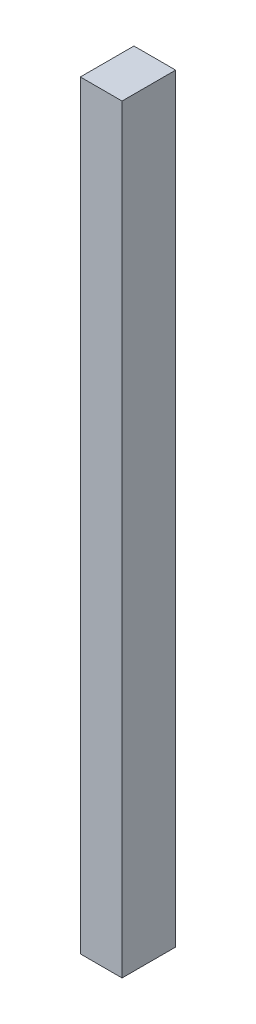
ISO-10303-21;
HEADER;
FILE_DESCRIPTION(('STEP AP214'),'2;1');
FILE_NAME('part.step','',(''),(''),'','','');
FILE_SCHEMA(('AUTOMOTIVE_DESIGN { 1 0 10303 214 1 1 1 1 }'));
ENDSEC;
DATA;
#1=APPLICATION_CONTEXT('core data for automotive mechanical design processes');
#2=APPLICATION_PROTOCOL_DEFINITION('international standard','automotive_design',2000,#1);
#3=PRODUCT_CONTEXT('',#1,'mechanical');
#4=PRODUCT('Part','Part','',(#3));
#5=PRODUCT_RELATED_PRODUCT_CATEGORY('part','',(#4));
#6=PRODUCT_DEFINITION_FORMATION('','',#4);
#7=PRODUCT_DEFINITION_CONTEXT('part definition',#1,'design');
#8=PRODUCT_DEFINITION('design','',#6,#7);
#9=PRODUCT_DEFINITION_SHAPE('','',#8);
#10=(LENGTH_UNIT() NAMED_UNIT(*) SI_UNIT(.MILLI.,.METRE.));
#11=(NAMED_UNIT(*) PLANE_ANGLE_UNIT() SI_UNIT($,.RADIAN.));
#12=(NAMED_UNIT(*) SI_UNIT($,.STERADIAN.) SOLID_ANGLE_UNIT());
#13=UNCERTAINTY_MEASURE_WITH_UNIT(LENGTH_MEASURE(1.E-05),#10,'distance_accuracy_value','');
#14=(GEOMETRIC_REPRESENTATION_CONTEXT(3) GLOBAL_UNCERTAINTY_ASSIGNED_CONTEXT((#13)) GLOBAL_UNIT_ASSIGNED_CONTEXT((#10,
#11,#12)) REPRESENTATION_CONTEXT('',''));
#15=CARTESIAN_POINT('',(0.,0.,0.));
#16=DIRECTION('',(0.,0.,1.));
#17=DIRECTION('',(1.,0.,0.));
#18=AXIS2_PLACEMENT_3D('',#15,#16,#17);
#19=CARTESIAN_POINT('',(0.,700.,49.4));
#20=DIRECTION('',(1.,0.,0.));
#21=DIRECTION('',(0.,0.,-1.));
#22=AXIS2_PLACEMENT_3D('',#19,#20,#21);
#23=PLANE('',#22);
#24=DIRECTION('',(0.,0.,1.));
#25=VECTOR('',#24,1.);
#26=CARTESIAN_POINT('',(0.,0.,49.4));
#27=LINE('',#26,#25);
#28=CARTESIAN_POINT('',(0.,0.,0.));
#29=VERTEX_POINT('',#28);
#30=CARTESIAN_POINT('',(0.,0.,49.4));
#31=VERTEX_POINT('',#30);
#32=EDGE_CURVE('E96',#29,#31,#27,.T.);
#33=ORIENTED_EDGE('',*,*,#32,.T.);
#34=DIRECTION('',(0.,-1.,0.));
#35=VECTOR('',#34,1.);
#36=CARTESIAN_POINT('',(0.,700.,49.4));
#37=LINE('',#36,#35);
#38=CARTESIAN_POINT('',(0.,700.,49.4));
#39=VERTEX_POINT('',#38);
#40=EDGE_CURVE('E11',#39,#31,#37,.T.);
#41=ORIENTED_EDGE('',*,*,#40,.F.);
#42=DIRECTION('',(0.,0.,1.));
#43=VECTOR('',#42,1.);
#44=CARTESIAN_POINT('',(0.,700.,49.4));
#45=LINE('',#44,#43);
#46=CARTESIAN_POINT('',(0.,700.,0.));
#47=VERTEX_POINT('',#46);
#48=EDGE_CURVE('E84',#47,#39,#45,.T.);
#49=ORIENTED_EDGE('',*,*,#48,.F.);
#50=DIRECTION('',(0.,-1.,0.));
#51=VECTOR('',#50,1.);
#52=CARTESIAN_POINT('',(0.,700.,0.));
#53=LINE('',#52,#51);
#54=EDGE_CURVE('E92',#47,#29,#53,.T.);
#55=ORIENTED_EDGE('',*,*,#54,.T.);
#56=EDGE_LOOP('',(#33,#41,#49,#55));
#57=FACE_BOUND('',#56,.T.);
#58=ADVANCED_FACE('F33',(#57),#23,.F.);
#59=CARTESIAN_POINT('',(38.45,700.,49.4));
#60=DIRECTION('',(0.,0.,-1.));
#61=DIRECTION('',(-1.,0.,0.));
#62=AXIS2_PLACEMENT_3D('',#59,#60,#61);
#63=PLANE('',#62);
#64=DIRECTION('',(1.,0.,0.));
#65=VECTOR('',#64,1.);
#66=CARTESIAN_POINT('',(38.45,0.,49.4));
#67=LINE('',#66,#65);
#68=CARTESIAN_POINT('',(38.45,0.,49.4));
#69=VERTEX_POINT('',#68);
#70=EDGE_CURVE('E88',#31,#69,#67,.T.);
#71=ORIENTED_EDGE('',*,*,#70,.T.);
#72=DIRECTION('',(0.,-1.,0.));
#73=VECTOR('',#72,1.);
#74=CARTESIAN_POINT('',(38.45,700.,49.4));
#75=LINE('',#74,#73);
#76=CARTESIAN_POINT('',(38.45,700.,49.4));
#77=VERTEX_POINT('',#76);
#78=EDGE_CURVE('E41',#77,#69,#75,.T.);
#79=ORIENTED_EDGE('',*,*,#78,.F.);
#80=DIRECTION('',(1.,0.,0.));
#81=VECTOR('',#80,1.);
#82=CARTESIAN_POINT('',(38.45,700.,49.4));
#83=LINE('',#82,#81);
#84=EDGE_CURVE('E79',#39,#77,#83,.T.);
#85=ORIENTED_EDGE('',*,*,#84,.F.);
#86=ORIENTED_EDGE('',*,*,#40,.T.);
#87=EDGE_LOOP('',(#71,#79,#85,#86));
#88=FACE_BOUND('',#87,.T.);
#89=ADVANCED_FACE('F87',(#88),#63,.F.);
#90=CARTESIAN_POINT('',(38.45,700.,0.));
#91=DIRECTION('',(-1.,0.,0.));
#92=DIRECTION('',(0.,0.,1.));
#93=AXIS2_PLACEMENT_3D('',#90,#91,#92);
#94=PLANE('',#93);
#95=DIRECTION('',(0.,0.,-1.));
#96=VECTOR('',#95,1.);
#97=CARTESIAN_POINT('',(38.45,0.,0.));
#98=LINE('',#97,#96);
#99=CARTESIAN_POINT('',(38.45,0.,0.));
#100=VERTEX_POINT('',#99);
#101=EDGE_CURVE('E66',#69,#100,#98,.T.);
#102=ORIENTED_EDGE('',*,*,#101,.T.);
#103=DIRECTION('',(0.,-1.,0.));
#104=VECTOR('',#103,1.);
#105=CARTESIAN_POINT('',(38.45,700.,0.));
#106=LINE('',#105,#104);
#107=CARTESIAN_POINT('',(38.45,700.,0.));
#108=VERTEX_POINT('',#107);
#109=EDGE_CURVE('E89',#108,#100,#106,.T.);
#110=ORIENTED_EDGE('',*,*,#109,.F.);
#111=DIRECTION('',(0.,0.,-1.));
#112=VECTOR('',#111,1.);
#113=CARTESIAN_POINT('',(38.45,700.,0.));
#114=LINE('',#113,#112);
#115=EDGE_CURVE('E82',#77,#108,#114,.T.);
#116=ORIENTED_EDGE('',*,*,#115,.F.);
#117=ORIENTED_EDGE('',*,*,#78,.T.);
#118=EDGE_LOOP('',(#102,#110,#116,#117));
#119=FACE_BOUND('',#118,.T.);
#120=ADVANCED_FACE('F90',(#119),#94,.F.);
#121=CARTESIAN_POINT('',(0.,700.,0.));
#122=DIRECTION('',(0.,0.,1.));
#123=DIRECTION('',(1.,0.,0.));
#124=AXIS2_PLACEMENT_3D('',#121,#122,#123);
#125=PLANE('',#124);
#126=DIRECTION('',(-1.,0.,0.));
#127=VECTOR('',#126,1.);
#128=CARTESIAN_POINT('',(0.,0.,0.));
#129=LINE('',#128,#127);
#130=EDGE_CURVE('E72',#100,#29,#129,.T.);
#131=ORIENTED_EDGE('',*,*,#130,.T.);
#132=ORIENTED_EDGE('',*,*,#54,.F.);
#133=DIRECTION('',(-1.,0.,0.));
#134=VECTOR('',#133,1.);
#135=CARTESIAN_POINT('',(0.,700.,0.));
#136=LINE('',#135,#134);
#137=EDGE_CURVE('E49',#108,#47,#136,.T.);
#138=ORIENTED_EDGE('',*,*,#137,.F.);
#139=ORIENTED_EDGE('',*,*,#109,.T.);
#140=EDGE_LOOP('',(#131,#132,#138,#139));
#141=FACE_BOUND('',#140,.T.);
#142=ADVANCED_FACE('F103',(#141),#125,.F.);
#143=CARTESIAN_POINT('',(0.,700.,0.));
#144=DIRECTION('',(0.,-1.,0.));
#145=DIRECTION('',(0.,0.,-1.));
#146=AXIS2_PLACEMENT_3D('',#143,#144,#145);
#147=PLANE('',#146);
#148=ORIENTED_EDGE('',*,*,#48,.T.);
#149=ORIENTED_EDGE('',*,*,#84,.T.);
#150=ORIENTED_EDGE('',*,*,#115,.T.);
#151=ORIENTED_EDGE('',*,*,#137,.T.);
#152=EDGE_LOOP('',(#148,#149,#150,#151));
#153=FACE_BOUND('',#152,.T.);
#154=ADVANCED_FACE('F80',(#153),#147,.F.);
#155=CARTESIAN_POINT('',(0.,0.,0.));
#156=DIRECTION('',(0.,-1.,0.));
#157=DIRECTION('',(0.,0.,-1.));
#158=AXIS2_PLACEMENT_3D('',#155,#156,#157);
#159=PLANE('',#158);
#160=ORIENTED_EDGE('',*,*,#32,.F.);
#161=ORIENTED_EDGE('',*,*,#130,.F.);
#162=ORIENTED_EDGE('',*,*,#101,.F.);
#163=ORIENTED_EDGE('',*,*,#70,.F.);
#164=EDGE_LOOP('',(#160,#161,#162,#163));
#165=FACE_BOUND('',#164,.T.);
#166=ADVANCED_FACE('F106',(#165),#159,.T.);
#167=CLOSED_SHELL('',(#58,#89,#120,#142,#154,#166));
#168=MANIFOLD_SOLID_BREP('B2',#167);
#169=ADVANCED_BREP_SHAPE_REPRESENTATION('',(#18,#168),#14);
#170=SHAPE_DEFINITION_REPRESENTATION(#9,#169);
ENDSEC;
END-ISO-10303-21;
